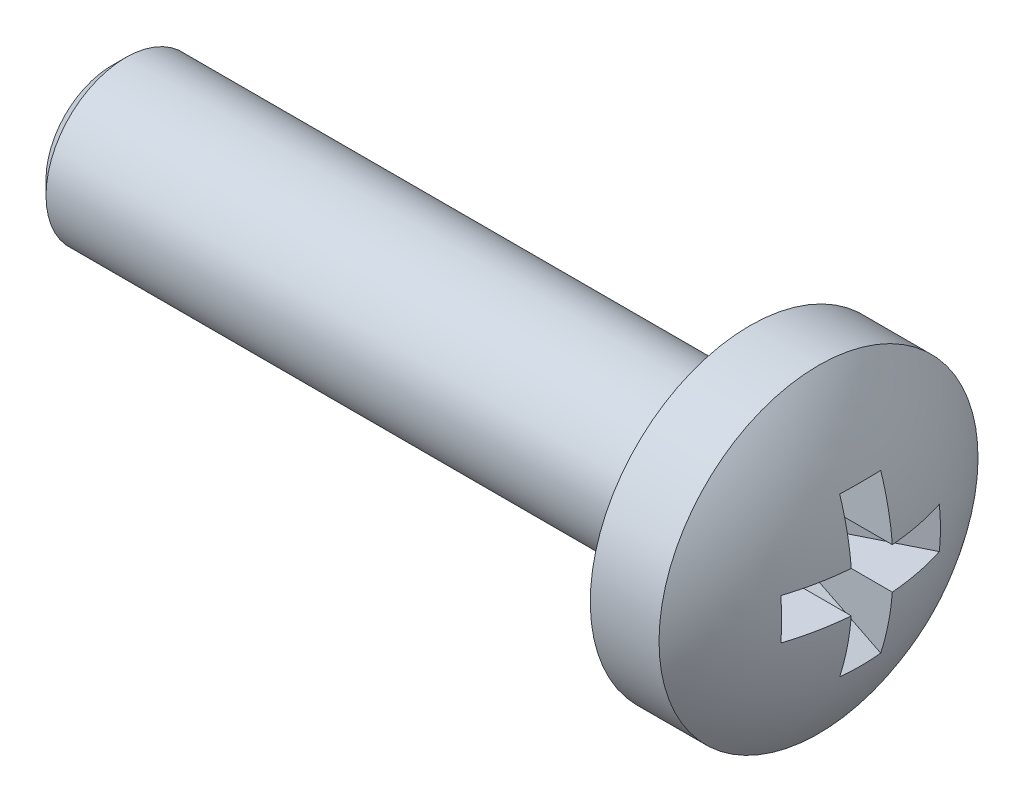
ISO-10303-21;
HEADER;
FILE_DESCRIPTION(('STEP AP214'),'2;1');
FILE_NAME('part.step','',(''),(''),'','','');
FILE_SCHEMA(('AUTOMOTIVE_DESIGN { 1 0 10303 214 1 1 1 1 }'));
ENDSEC;
DATA;
#1=APPLICATION_CONTEXT('core data for automotive mechanical design processes');
#2=APPLICATION_PROTOCOL_DEFINITION('international standard','automotive_design',2000,#1);
#3=PRODUCT_CONTEXT('',#1,'mechanical');
#4=PRODUCT('Part','Part','',(#3));
#5=PRODUCT_RELATED_PRODUCT_CATEGORY('part','',(#4));
#6=PRODUCT_DEFINITION_FORMATION('','',#4);
#7=PRODUCT_DEFINITION_CONTEXT('part definition',#1,'design');
#8=PRODUCT_DEFINITION('design','',#6,#7);
#9=PRODUCT_DEFINITION_SHAPE('','',#8);
#10=(LENGTH_UNIT() NAMED_UNIT(*) SI_UNIT(.MILLI.,.METRE.));
#11=(NAMED_UNIT(*) PLANE_ANGLE_UNIT() SI_UNIT($,.RADIAN.));
#12=(NAMED_UNIT(*) SI_UNIT($,.STERADIAN.) SOLID_ANGLE_UNIT());
#13=UNCERTAINTY_MEASURE_WITH_UNIT(LENGTH_MEASURE(1.E-05),#10,'distance_accuracy_value','');
#14=(GEOMETRIC_REPRESENTATION_CONTEXT(3) GLOBAL_UNCERTAINTY_ASSIGNED_CONTEXT((#13)) GLOBAL_UNIT_ASSIGNED_CONTEXT((#10,
#11,#12)) REPRESENTATION_CONTEXT('',''));
#15=CARTESIAN_POINT('',(0.,0.,0.));
#16=DIRECTION('',(0.,0.,1.));
#17=DIRECTION('',(1.,0.,0.));
#18=AXIS2_PLACEMENT_3D('',#15,#16,#17);
#19=CARTESIAN_POINT('',(-6.5,0.,0.));
#20=DIRECTION('',(1.,0.,0.));
#21=DIRECTION('',(0.,-1.,0.));
#22=AXIS2_PLACEMENT_3D('',#19,#20,#21);
#23=SPHERICAL_SURFACE('',#22,6.5);
#24=CARTESIAN_POINT('',(-6.06443199854499,0.,-0.873614257765256));
#25=DIRECTION('',(0.446197813109809,0.,-0.894934361602025));
#26=DIRECTION('',(-0.894934361602025,0.,-0.446197813109809));
#27=AXIS2_PLACEMENT_3D('',#24,#25,#26);
#28=CIRCLE('',#27,6.42628031171515);
#29=CARTESIAN_POINT('',(-0.331830512486634,0.515,1.98455540948322));
#30=VERTEX_POINT('',#29);
#31=CARTESIAN_POINT('',(-0.331830512486634,-0.515,1.98455540948322));
#32=VERTEX_POINT('',#31);
#33=EDGE_CURVE('E195',#30,#32,#28,.T.);
#34=ORIENTED_EDGE('',*,*,#33,.F.);
#35=CARTESIAN_POINT('',(-6.5,0.515,0.));
#36=DIRECTION('',(0.,-1.,0.));
#37=DIRECTION('',(0.,0.,-1.));
#38=AXIS2_PLACEMENT_3D('',#35,#36,#37);
#39=CIRCLE('',#38,6.47956595768575);
#40=CARTESIAN_POINT('',(-0.0409327298750029,0.515,0.515));
#41=VERTEX_POINT('',#40);
#42=EDGE_CURVE('E114',#30,#41,#39,.F.);
#43=ORIENTED_EDGE('',*,*,#42,.T.);
#44=CARTESIAN_POINT('',(-6.5,0.,0.515));
#45=DIRECTION('',(0.,0.,1.));
#46=DIRECTION('',(0.,-1.,0.));
#47=AXIS2_PLACEMENT_3D('',#44,#45,#46);
#48=CIRCLE('',#47,6.47956595768575);
#49=CARTESIAN_POINT('',(-0.331830512486634,1.98455540948322,0.515));
#50=VERTEX_POINT('',#49);
#51=EDGE_CURVE('E146',#50,#41,#48,.F.);
#52=ORIENTED_EDGE('',*,*,#51,.F.);
#53=CARTESIAN_POINT('',(-6.06443199854499,-0.873614257765256,0.));
#54=DIRECTION('',(0.446197813109809,-0.894934361602025,0.));
#55=DIRECTION('',(0.894934361602025,0.446197813109809,0.));
#56=AXIS2_PLACEMENT_3D('',#53,#54,#55);
#57=CIRCLE('',#56,6.42628031171515);
#58=CARTESIAN_POINT('',(-0.331830512486634,1.98455540948322,-0.515));
#59=VERTEX_POINT('',#58);
#60=EDGE_CURVE('E143',#50,#59,#57,.F.);
#61=ORIENTED_EDGE('',*,*,#60,.T.);
#62=CARTESIAN_POINT('',(-6.5,0.,-0.515));
#63=DIRECTION('',(0.,0.,1.));
#64=DIRECTION('',(0.,-1.,0.));
#65=AXIS2_PLACEMENT_3D('',#62,#63,#64);
#66=CIRCLE('',#65,6.47956595768575);
#67=CARTESIAN_POINT('',(-0.0409327298750029,0.515,-0.515));
#68=VERTEX_POINT('',#67);
#69=EDGE_CURVE('E147',#59,#68,#66,.F.);
#70=ORIENTED_EDGE('',*,*,#69,.T.);
#71=CARTESIAN_POINT('',(-6.5,0.515,0.));
#72=DIRECTION('',(0.,-1.,0.));
#73=DIRECTION('',(0.,0.,-1.));
#74=AXIS2_PLACEMENT_3D('',#71,#72,#73);
#75=CIRCLE('',#74,6.47956595768575);
#76=CARTESIAN_POINT('',(-0.331830512486634,0.515,-1.98455540948322));
#77=VERTEX_POINT('',#76);
#78=EDGE_CURVE('E197',#68,#77,#75,.F.);
#79=ORIENTED_EDGE('',*,*,#78,.T.);
#80=CARTESIAN_POINT('',(-6.06443199854499,0.,0.873614257765255));
#81=DIRECTION('',(0.446197813109809,0.,0.894934361602025));
#82=DIRECTION('',(0.894934361602025,0.,-0.446197813109809));
#83=AXIS2_PLACEMENT_3D('',#80,#81,#82);
#84=CIRCLE('',#83,6.42628031171515);
#85=CARTESIAN_POINT('',(-0.331830512486634,-0.515,-1.98455540948322));
#86=VERTEX_POINT('',#85);
#87=EDGE_CURVE('E200',#77,#86,#84,.F.);
#88=ORIENTED_EDGE('',*,*,#87,.T.);
#89=CARTESIAN_POINT('',(-6.5,-0.515,0.));
#90=DIRECTION('',(0.,-1.,0.));
#91=DIRECTION('',(0.,0.,-1.));
#92=AXIS2_PLACEMENT_3D('',#89,#90,#91);
#93=CIRCLE('',#92,6.47956595768575);
#94=CARTESIAN_POINT('',(-0.0409327298750029,-0.515,-0.515));
#95=VERTEX_POINT('',#94);
#96=EDGE_CURVE('E201',#95,#86,#93,.F.);
#97=ORIENTED_EDGE('',*,*,#96,.F.);
#98=CARTESIAN_POINT('',(-6.5,0.,-0.515));
#99=DIRECTION('',(0.,0.,1.));
#100=DIRECTION('',(0.,-1.,0.));
#101=AXIS2_PLACEMENT_3D('',#98,#99,#100);
#102=CIRCLE('',#101,6.47956595768575);
#103=CARTESIAN_POINT('',(-0.331830512486634,-1.98455540948322,-0.515));
#104=VERTEX_POINT('',#103);
#105=EDGE_CURVE('E157',#95,#104,#102,.F.);
#106=ORIENTED_EDGE('',*,*,#105,.T.);
#107=CARTESIAN_POINT('',(-6.06443199854499,0.873614257765256,0.));
#108=DIRECTION('',(0.446197813109809,0.894934361602025,0.));
#109=DIRECTION('',(-0.894934361602025,0.446197813109809,0.));
#110=AXIS2_PLACEMENT_3D('',#107,#108,#109);
#111=CIRCLE('',#110,6.42628031171515);
#112=CARTESIAN_POINT('',(-0.331830512486634,-1.98455540948322,0.515));
#113=VERTEX_POINT('',#112);
#114=EDGE_CURVE('E154',#113,#104,#111,.T.);
#115=ORIENTED_EDGE('',*,*,#114,.F.);
#116=CARTESIAN_POINT('',(-6.5,0.,0.515));
#117=DIRECTION('',(0.,0.,1.));
#118=DIRECTION('',(0.,-1.,0.));
#119=AXIS2_PLACEMENT_3D('',#116,#117,#118);
#120=CIRCLE('',#119,6.47956595768575);
#121=CARTESIAN_POINT('',(-0.0409327298750029,-0.515,0.515));
#122=VERTEX_POINT('',#121);
#123=EDGE_CURVE('E158',#122,#113,#120,.F.);
#124=ORIENTED_EDGE('',*,*,#123,.F.);
#125=CARTESIAN_POINT('',(-6.5,-0.515,0.));
#126=DIRECTION('',(0.,-1.,0.));
#127=DIRECTION('',(0.,0.,-1.));
#128=AXIS2_PLACEMENT_3D('',#125,#126,#127);
#129=CIRCLE('',#128,6.47956595768575);
#130=EDGE_CURVE('E193',#32,#122,#129,.F.);
#131=ORIENTED_EDGE('',*,*,#130,.F.);
#132=EDGE_LOOP('',(#34,#43,#52,#61,#70,#79,#88,#97,#106,#115,#124,#131));
#133=FACE_BOUND('',#132,.T.);
#134=CARTESIAN_POINT('',(-1.3765246170202,0.,0.));
#135=DIRECTION('',(1.,0.,0.));
#136=DIRECTION('',(0.,1.,0.));
#137=AXIS2_PLACEMENT_3D('',#134,#135,#136);
#138=CIRCLE('',#137,4.);
#139=CARTESIAN_POINT('',(-1.3765246170202,4.,0.));
#140=VERTEX_POINT('',#139);
#141=EDGE_CURVE('E118',#140,#140,#138,.T.);
#142=ORIENTED_EDGE('',*,*,#141,.T.);
#143=EDGE_LOOP('',(#142));
#144=FACE_BOUND('',#143,.T.);
#145=ADVANCED_FACE('F16',(#133,#144),#23,.T.);
#146=CARTESIAN_POINT('',(-19.1,0.,0.));
#147=DIRECTION('',(-1.,0.,0.));
#148=DIRECTION('',(0.,-1.,0.));
#149=AXIS2_PLACEMENT_3D('',#146,#147,#148);
#150=PLANE('',#149);
#151=CARTESIAN_POINT('',(-19.1,0.,0.));
#152=DIRECTION('',(-1.,0.,0.));
#153=DIRECTION('',(0.,-1.,0.));
#154=AXIS2_PLACEMENT_3D('',#151,#152,#153);
#155=CIRCLE('',#154,1.65);
#156=CARTESIAN_POINT('',(-19.1,-1.65,0.));
#157=VERTEX_POINT('',#156);
#158=EDGE_CURVE('E10',#157,#157,#155,.T.);
#159=ORIENTED_EDGE('',*,*,#158,.T.);
#160=EDGE_LOOP('',(#159));
#161=FACE_BOUND('',#160,.T.);
#162=ADVANCED_FACE('F262',(#161),#150,.T.);
#163=CARTESIAN_POINT('',(0.,0.,0.));
#164=DIRECTION('',(1.,0.,0.));
#165=DIRECTION('',(0.,1.,0.));
#166=AXIS2_PLACEMENT_3D('',#163,#164,#165);
#167=CYLINDRICAL_SURFACE('',#166,2.);
#168=CARTESIAN_POINT('',(-18.75,0.,0.));
#169=DIRECTION('',(-1.,0.,0.));
#170=DIRECTION('',(0.,-1.,0.));
#171=AXIS2_PLACEMENT_3D('',#168,#169,#170);
#172=CIRCLE('',#171,2.);
#173=CARTESIAN_POINT('',(-18.75,-2.,0.));
#174=VERTEX_POINT('',#173);
#175=EDGE_CURVE('E26',#174,#174,#172,.F.);
#176=ORIENTED_EDGE('',*,*,#175,.T.);
#177=EDGE_LOOP('',(#176));
#178=FACE_BOUND('',#177,.T.);
#179=CARTESIAN_POINT('',(-3.1,0.,0.));
#180=DIRECTION('',(1.,0.,0.));
#181=DIRECTION('',(0.,1.,0.));
#182=AXIS2_PLACEMENT_3D('',#179,#180,#181);
#183=CIRCLE('',#182,2.);
#184=CARTESIAN_POINT('',(-3.1,2.,0.));
#185=VERTEX_POINT('',#184);
#186=EDGE_CURVE('E190',#185,#185,#183,.T.);
#187=ORIENTED_EDGE('',*,*,#186,.F.);
#188=EDGE_LOOP('',(#187));
#189=FACE_BOUND('',#188,.T.);
#190=ADVANCED_FACE('F268',(#178,#189),#167,.T.);
#191=CARTESIAN_POINT('',(-3.1,2.,0.));
#192=DIRECTION('',(-1.,0.,0.));
#193=DIRECTION('',(0.,-1.,0.));
#194=AXIS2_PLACEMENT_3D('',#191,#192,#193);
#195=PLANE('',#194);
#196=ORIENTED_EDGE('',*,*,#186,.T.);
#197=EDGE_LOOP('',(#196));
#198=FACE_BOUND('',#197,.T.);
#199=CARTESIAN_POINT('',(-3.1,0.,0.));
#200=DIRECTION('',(1.,0.,0.));
#201=DIRECTION('',(0.,1.,0.));
#202=AXIS2_PLACEMENT_3D('',#199,#200,#201);
#203=CIRCLE('',#202,4.);
#204=CARTESIAN_POINT('',(-3.1,4.,0.));
#205=VERTEX_POINT('',#204);
#206=EDGE_CURVE('E187',#205,#205,#203,.T.);
#207=ORIENTED_EDGE('',*,*,#206,.F.);
#208=EDGE_LOOP('',(#207));
#209=FACE_BOUND('',#208,.T.);
#210=ADVANCED_FACE('F299',(#198,#209),#195,.T.);
#211=CARTESIAN_POINT('',(0.,0.,0.));
#212=DIRECTION('',(1.,0.,0.));
#213=DIRECTION('',(0.,1.,0.));
#214=AXIS2_PLACEMENT_3D('',#211,#212,#213);
#215=CYLINDRICAL_SURFACE('',#214,4.);
#216=ORIENTED_EDGE('',*,*,#206,.T.);
#217=EDGE_LOOP('',(#216));
#218=FACE_BOUND('',#217,.T.);
#219=ORIENTED_EDGE('',*,*,#141,.F.);
#220=EDGE_LOOP('',(#219));
#221=FACE_BOUND('',#220,.T.);
#222=ADVANCED_FACE('F296',(#218,#221),#215,.T.);
#223=CARTESIAN_POINT('',(0.,0.,2.15));
#224=DIRECTION('',(0.446197813109809,0.,-0.894934361602025));
#225=DIRECTION('',(-0.894934361602025,0.,-0.446197813109809));
#226=AXIS2_PLACEMENT_3D('',#223,#224,#225);
#227=PLANE('',#226);
#228=ORIENTED_EDGE('',*,*,#33,.T.);
#229=DIRECTION('',(-0.894934361602025,0.,-0.44619781310981));
#230=VECTOR('',#229,1.);
#231=CARTESIAN_POINT('',(0.,-0.515,2.15));
#232=LINE('',#231,#230);
#233=CARTESIAN_POINT('',(-2.34,-0.515,0.983319037154967));
#234=VERTEX_POINT('',#233);
#235=EDGE_CURVE('E35',#234,#32,#232,.F.);
#236=ORIENTED_EDGE('',*,*,#235,.F.);
#237=DIRECTION('',(0.,1.,0.));
#238=VECTOR('',#237,1.);
#239=CARTESIAN_POINT('',(-2.34,0.,0.983319037154967));
#240=LINE('',#239,#238);
#241=CARTESIAN_POINT('',(-2.34,0.515,0.983319037154967));
#242=VERTEX_POINT('',#241);
#243=EDGE_CURVE('E126',#242,#234,#240,.F.);
#244=ORIENTED_EDGE('',*,*,#243,.F.);
#245=DIRECTION('',(-0.894934361602025,0.,-0.44619781310981));
#246=VECTOR('',#245,1.);
#247=CARTESIAN_POINT('',(0.,0.515,2.15));
#248=LINE('',#247,#246);
#249=EDGE_CURVE('E107',#242,#30,#248,.F.);
#250=ORIENTED_EDGE('',*,*,#249,.T.);
#251=EDGE_LOOP('',(#228,#236,#244,#250));
#252=FACE_BOUND('',#251,.T.);
#253=ADVANCED_FACE('F18',(#252),#227,.T.);
#254=CARTESIAN_POINT('',(-2.34,0.515,0.));
#255=DIRECTION('',(0.,-1.,0.));
#256=DIRECTION('',(0.,0.,-1.));
#257=AXIS2_PLACEMENT_3D('',#254,#255,#256);
#258=PLANE('',#257);
#259=ORIENTED_EDGE('',*,*,#249,.F.);
#260=DIRECTION('',(0.,0.,-1.));
#261=VECTOR('',#260,1.);
#262=CARTESIAN_POINT('',(-2.34,0.515,0.));
#263=LINE('',#262,#261);
#264=CARTESIAN_POINT('',(-2.34,0.515,0.515));
#265=VERTEX_POINT('',#264);
#266=EDGE_CURVE('E111',#242,#265,#263,.T.);
#267=ORIENTED_EDGE('',*,*,#266,.T.);
#268=DIRECTION('',(1.,0.,0.));
#269=VECTOR('',#268,1.);
#270=CARTESIAN_POINT('',(-2.34,0.515,0.515));
#271=LINE('',#270,#269);
#272=EDGE_CURVE('E119',#265,#41,#271,.T.);
#273=ORIENTED_EDGE('',*,*,#272,.T.);
#274=ORIENTED_EDGE('',*,*,#42,.F.);
#275=EDGE_LOOP('',(#259,#267,#273,#274));
#276=FACE_BOUND('',#275,.T.);
#277=ADVANCED_FACE('F109',(#276),#258,.T.);
#278=CARTESIAN_POINT('',(-2.34,0.,0.515));
#279=DIRECTION('',(0.,0.,1.));
#280=DIRECTION('',(0.,-1.,0.));
#281=AXIS2_PLACEMENT_3D('',#278,#279,#280);
#282=PLANE('',#281);
#283=ORIENTED_EDGE('',*,*,#51,.T.);
#284=ORIENTED_EDGE('',*,*,#272,.F.);
#285=DIRECTION('',(0.,-1.,0.));
#286=VECTOR('',#285,1.);
#287=CARTESIAN_POINT('',(-2.34,0.,0.515));
#288=LINE('',#287,#286);
#289=CARTESIAN_POINT('',(-2.34,0.983319037154967,0.515));
#290=VERTEX_POINT('',#289);
#291=EDGE_CURVE('E129',#290,#265,#288,.T.);
#292=ORIENTED_EDGE('',*,*,#291,.F.);
#293=DIRECTION('',(0.894934361602025,0.44619781310981,0.));
#294=VECTOR('',#293,1.);
#295=CARTESIAN_POINT('',(-2.73265675038874,0.787547603133116,0.515));
#296=LINE('',#295,#294);
#297=EDGE_CURVE('E139',#290,#50,#296,.T.);
#298=ORIENTED_EDGE('',*,*,#297,.T.);
#299=EDGE_LOOP('',(#283,#284,#292,#298));
#300=FACE_BOUND('',#299,.T.);
#301=ADVANCED_FACE('F250',(#300),#282,.F.);
#302=CARTESIAN_POINT('',(0.,2.15,0.));
#303=DIRECTION('',(0.446197813109809,-0.894934361602025,0.));
#304=DIRECTION('',(0.894934361602025,0.446197813109809,0.));
#305=AXIS2_PLACEMENT_3D('',#302,#303,#304);
#306=PLANE('',#305);
#307=ORIENTED_EDGE('',*,*,#297,.F.);
#308=DIRECTION('',(0.,0.,-1.));
#309=VECTOR('',#308,1.);
#310=CARTESIAN_POINT('',(-2.34,0.983319037154967,0.));
#311=LINE('',#310,#309);
#312=CARTESIAN_POINT('',(-2.34,0.983319037154967,-0.515));
#313=VERTEX_POINT('',#312);
#314=EDGE_CURVE('E151',#290,#313,#311,.T.);
#315=ORIENTED_EDGE('',*,*,#314,.T.);
#316=DIRECTION('',(0.894934361602025,0.44619781310981,0.));
#317=VECTOR('',#316,1.);
#318=CARTESIAN_POINT('',(-2.73265675038874,0.787547603133116,-0.515));
#319=LINE('',#318,#317);
#320=EDGE_CURVE('E142',#313,#59,#319,.T.);
#321=ORIENTED_EDGE('',*,*,#320,.T.);
#322=ORIENTED_EDGE('',*,*,#60,.F.);
#323=EDGE_LOOP('',(#307,#315,#321,#322));
#324=FACE_BOUND('',#323,.T.);
#325=ADVANCED_FACE('F248',(#324),#306,.T.);
#326=CARTESIAN_POINT('',(-2.34,0.,-0.515));
#327=DIRECTION('',(0.,0.,1.));
#328=DIRECTION('',(0.,-1.,0.));
#329=AXIS2_PLACEMENT_3D('',#326,#327,#328);
#330=PLANE('',#329);
#331=ORIENTED_EDGE('',*,*,#320,.F.);
#332=DIRECTION('',(0.,-1.,0.));
#333=VECTOR('',#332,1.);
#334=CARTESIAN_POINT('',(-2.34,0.,-0.515));
#335=LINE('',#334,#333);
#336=CARTESIAN_POINT('',(-2.34,0.515,-0.515));
#337=VERTEX_POINT('',#336);
#338=EDGE_CURVE('E153',#313,#337,#335,.T.);
#339=ORIENTED_EDGE('',*,*,#338,.T.);
#340=DIRECTION('',(1.,0.,0.));
#341=VECTOR('',#340,1.);
#342=CARTESIAN_POINT('',(-2.34,0.515,-0.515));
#343=LINE('',#342,#341);
#344=EDGE_CURVE('E150',#337,#68,#343,.T.);
#345=ORIENTED_EDGE('',*,*,#344,.T.);
#346=ORIENTED_EDGE('',*,*,#69,.F.);
#347=EDGE_LOOP('',(#331,#339,#345,#346));
#348=FACE_BOUND('',#347,.T.);
#349=ADVANCED_FACE('F245',(#348),#330,.T.);
#350=CARTESIAN_POINT('',(-2.34,0.515,0.));
#351=DIRECTION('',(0.,-1.,0.));
#352=DIRECTION('',(0.,0.,-1.));
#353=AXIS2_PLACEMENT_3D('',#350,#351,#352);
#354=PLANE('',#353);
#355=ORIENTED_EDGE('',*,*,#344,.F.);
#356=DIRECTION('',(0.,0.,-1.));
#357=VECTOR('',#356,1.);
#358=CARTESIAN_POINT('',(-2.34,0.515,0.));
#359=LINE('',#358,#357);
#360=CARTESIAN_POINT('',(-2.34,0.515,-0.983319037154968));
#361=VERTEX_POINT('',#360);
#362=EDGE_CURVE('E173',#337,#361,#359,.T.);
#363=ORIENTED_EDGE('',*,*,#362,.T.);
#364=DIRECTION('',(0.894934361602025,0.,-0.44619781310981));
#365=VECTOR('',#364,1.);
#366=CARTESIAN_POINT('',(0.,0.515,-2.15));
#367=LINE('',#366,#365);
#368=EDGE_CURVE('E180',#361,#77,#367,.T.);
#369=ORIENTED_EDGE('',*,*,#368,.T.);
#370=ORIENTED_EDGE('',*,*,#78,.F.);
#371=EDGE_LOOP('',(#355,#363,#369,#370));
#372=FACE_BOUND('',#371,.T.);
#373=ADVANCED_FACE('F242',(#372),#354,.T.);
#374=CARTESIAN_POINT('',(0.,0.,-2.15));
#375=DIRECTION('',(0.446197813109809,0.,0.894934361602025));
#376=DIRECTION('',(0.894934361602025,0.,-0.446197813109809));
#377=AXIS2_PLACEMENT_3D('',#374,#375,#376);
#378=PLANE('',#377);
#379=ORIENTED_EDGE('',*,*,#368,.F.);
#380=DIRECTION('',(0.,-1.,0.));
#381=VECTOR('',#380,1.);
#382=CARTESIAN_POINT('',(-2.34,0.,-0.983319037154968));
#383=LINE('',#382,#381);
#384=CARTESIAN_POINT('',(-2.34,-0.515,-0.983319037154968));
#385=VERTEX_POINT('',#384);
#386=EDGE_CURVE('E172',#361,#385,#383,.T.);
#387=ORIENTED_EDGE('',*,*,#386,.T.);
#388=DIRECTION('',(0.894934361602025,0.,-0.44619781310981));
#389=VECTOR('',#388,1.);
#390=CARTESIAN_POINT('',(0.,-0.515,-2.15));
#391=LINE('',#390,#389);
#392=EDGE_CURVE('E182',#385,#86,#391,.T.);
#393=ORIENTED_EDGE('',*,*,#392,.T.);
#394=ORIENTED_EDGE('',*,*,#87,.F.);
#395=EDGE_LOOP('',(#379,#387,#393,#394));
#396=FACE_BOUND('',#395,.T.);
#397=ADVANCED_FACE('F236',(#396),#378,.T.);
#398=CARTESIAN_POINT('',(-2.34,-0.515,0.));
#399=DIRECTION('',(0.,-1.,0.));
#400=DIRECTION('',(0.,0.,-1.));
#401=AXIS2_PLACEMENT_3D('',#398,#399,#400);
#402=PLANE('',#401);
#403=ORIENTED_EDGE('',*,*,#96,.T.);
#404=ORIENTED_EDGE('',*,*,#392,.F.);
#405=DIRECTION('',(0.,0.,-1.));
#406=VECTOR('',#405,1.);
#407=CARTESIAN_POINT('',(-2.34,-0.515,0.));
#408=LINE('',#407,#406);
#409=CARTESIAN_POINT('',(-2.34,-0.515,-0.515));
#410=VERTEX_POINT('',#409);
#411=EDGE_CURVE('E165',#410,#385,#408,.T.);
#412=ORIENTED_EDGE('',*,*,#411,.F.);
#413=DIRECTION('',(1.,0.,0.));
#414=VECTOR('',#413,1.);
#415=CARTESIAN_POINT('',(-2.34,-0.515,-0.515));
#416=LINE('',#415,#414);
#417=EDGE_CURVE('E79',#410,#95,#416,.T.);
#418=ORIENTED_EDGE('',*,*,#417,.T.);
#419=EDGE_LOOP('',(#403,#404,#412,#418));
#420=FACE_BOUND('',#419,.T.);
#421=ADVANCED_FACE('F232',(#420),#402,.F.);
#422=CARTESIAN_POINT('',(-2.34,0.,-0.515));
#423=DIRECTION('',(0.,0.,1.));
#424=DIRECTION('',(0.,-1.,0.));
#425=AXIS2_PLACEMENT_3D('',#422,#423,#424);
#426=PLANE('',#425);
#427=ORIENTED_EDGE('',*,*,#417,.F.);
#428=DIRECTION('',(0.,-1.,0.));
#429=VECTOR('',#428,1.);
#430=CARTESIAN_POINT('',(-2.34,0.,-0.515));
#431=LINE('',#430,#429);
#432=CARTESIAN_POINT('',(-2.34,-0.983319037154967,-0.515));
#433=VERTEX_POINT('',#432);
#434=EDGE_CURVE('E73',#410,#433,#431,.T.);
#435=ORIENTED_EDGE('',*,*,#434,.T.);
#436=DIRECTION('',(-0.894934361602025,0.44619781310981,0.));
#437=VECTOR('',#436,1.);
#438=CARTESIAN_POINT('',(-2.73265675038874,-0.787547603133116,-0.515));
#439=LINE('',#438,#437);
#440=EDGE_CURVE('E20',#433,#104,#439,.F.);
#441=ORIENTED_EDGE('',*,*,#440,.T.);
#442=ORIENTED_EDGE('',*,*,#105,.F.);
#443=EDGE_LOOP('',(#427,#435,#441,#442));
#444=FACE_BOUND('',#443,.T.);
#445=ADVANCED_FACE('F228',(#444),#426,.T.);
#446=CARTESIAN_POINT('',(0.,-2.15,0.));
#447=DIRECTION('',(0.446197813109809,0.894934361602025,0.));
#448=DIRECTION('',(-0.894934361602025,0.446197813109809,0.));
#449=AXIS2_PLACEMENT_3D('',#446,#447,#448);
#450=PLANE('',#449);
#451=ORIENTED_EDGE('',*,*,#114,.T.);
#452=ORIENTED_EDGE('',*,*,#440,.F.);
#453=DIRECTION('',(0.,0.,1.));
#454=VECTOR('',#453,1.);
#455=CARTESIAN_POINT('',(-2.34,-0.983319037154967,0.));
#456=LINE('',#455,#454);
#457=CARTESIAN_POINT('',(-2.34,-0.983319037154967,0.515));
#458=VERTEX_POINT('',#457);
#459=EDGE_CURVE('E161',#458,#433,#456,.F.);
#460=ORIENTED_EDGE('',*,*,#459,.F.);
#461=DIRECTION('',(-0.894934361602025,0.44619781310981,0.));
#462=VECTOR('',#461,1.);
#463=CARTESIAN_POINT('',(-2.73265675038874,-0.787547603133116,0.515));
#464=LINE('',#463,#462);
#465=EDGE_CURVE('E159',#458,#113,#464,.F.);
#466=ORIENTED_EDGE('',*,*,#465,.T.);
#467=EDGE_LOOP('',(#451,#452,#460,#466));
#468=FACE_BOUND('',#467,.T.);
#469=ADVANCED_FACE('F227',(#468),#450,.T.);
#470=CARTESIAN_POINT('',(-2.34,0.,0.515));
#471=DIRECTION('',(0.,0.,1.));
#472=DIRECTION('',(0.,-1.,0.));
#473=AXIS2_PLACEMENT_3D('',#470,#471,#472);
#474=PLANE('',#473);
#475=ORIENTED_EDGE('',*,*,#123,.T.);
#476=ORIENTED_EDGE('',*,*,#465,.F.);
#477=DIRECTION('',(0.,-1.,0.));
#478=VECTOR('',#477,1.);
#479=CARTESIAN_POINT('',(-2.34,0.,0.515));
#480=LINE('',#479,#478);
#481=CARTESIAN_POINT('',(-2.34,-0.515,0.515));
#482=VERTEX_POINT('',#481);
#483=EDGE_CURVE('E133',#482,#458,#480,.T.);
#484=ORIENTED_EDGE('',*,*,#483,.F.);
#485=DIRECTION('',(1.,0.,0.));
#486=VECTOR('',#485,1.);
#487=CARTESIAN_POINT('',(-2.34,-0.515,0.515));
#488=LINE('',#487,#486);
#489=EDGE_CURVE('E138',#482,#122,#488,.T.);
#490=ORIENTED_EDGE('',*,*,#489,.T.);
#491=EDGE_LOOP('',(#475,#476,#484,#490));
#492=FACE_BOUND('',#491,.T.);
#493=ADVANCED_FACE('F225',(#492),#474,.F.);
#494=CARTESIAN_POINT('',(-2.34,-0.515,0.));
#495=DIRECTION('',(0.,-1.,0.));
#496=DIRECTION('',(0.,0.,-1.));
#497=AXIS2_PLACEMENT_3D('',#494,#495,#496);
#498=PLANE('',#497);
#499=ORIENTED_EDGE('',*,*,#130,.T.);
#500=ORIENTED_EDGE('',*,*,#489,.F.);
#501=DIRECTION('',(0.,0.,-1.));
#502=VECTOR('',#501,1.);
#503=CARTESIAN_POINT('',(-2.34,-0.515,0.));
#504=LINE('',#503,#502);
#505=EDGE_CURVE('E131',#234,#482,#504,.T.);
#506=ORIENTED_EDGE('',*,*,#505,.F.);
#507=ORIENTED_EDGE('',*,*,#235,.T.);
#508=EDGE_LOOP('',(#499,#500,#506,#507));
#509=FACE_BOUND('',#508,.T.);
#510=ADVANCED_FACE('F223',(#509),#498,.F.);
#511=CARTESIAN_POINT('',(-2.34,0.,0.));
#512=DIRECTION('',(1.,0.,0.));
#513=DIRECTION('',(0.,0.,-1.));
#514=AXIS2_PLACEMENT_3D('',#511,#512,#513);
#515=PLANE('',#514);
#516=ORIENTED_EDGE('',*,*,#243,.T.);
#517=ORIENTED_EDGE('',*,*,#505,.T.);
#518=ORIENTED_EDGE('',*,*,#483,.T.);
#519=ORIENTED_EDGE('',*,*,#459,.T.);
#520=ORIENTED_EDGE('',*,*,#434,.F.);
#521=ORIENTED_EDGE('',*,*,#411,.T.);
#522=ORIENTED_EDGE('',*,*,#386,.F.);
#523=ORIENTED_EDGE('',*,*,#362,.F.);
#524=ORIENTED_EDGE('',*,*,#338,.F.);
#525=ORIENTED_EDGE('',*,*,#314,.F.);
#526=ORIENTED_EDGE('',*,*,#291,.T.);
#527=ORIENTED_EDGE('',*,*,#266,.F.);
#528=EDGE_LOOP('',(#516,#517,#518,#519,#520,#521,#522,#523,#524,#525,#526,#527));
#529=FACE_BOUND('',#528,.T.);
#530=ADVANCED_FACE('F124',(#529),#515,.T.);
#531=CARTESIAN_POINT('',(-18.75,0.,0.));
#532=DIRECTION('',(1.,0.,0.));
#533=DIRECTION('',(0.,1.,0.));
#534=AXIS2_PLACEMENT_3D('',#531,#532,#533);
#535=CONICAL_SURFACE('',#534,2.,0.785398163397447);
#536=ORIENTED_EDGE('',*,*,#158,.F.);
#537=EDGE_LOOP('',(#536));
#538=FACE_BOUND('',#537,.T.);
#539=ORIENTED_EDGE('',*,*,#175,.F.);
#540=EDGE_LOOP('',(#539));
#541=FACE_BOUND('',#540,.T.);
#542=ADVANCED_FACE('F273',(#538,#541),#535,.T.);
#543=CLOSED_SHELL('',(#145,#162,#190,#210,#222,#253,#277,#301,#325,#349,#373,#397,#421,#445,
#469,#493,#510,#530,#542));
#544=MANIFOLD_SOLID_BREP('B1',#543);
#545=ADVANCED_BREP_SHAPE_REPRESENTATION('',(#18,#544),#14);
#546=SHAPE_DEFINITION_REPRESENTATION(#9,#545);
ENDSEC;
END-ISO-10303-21;
